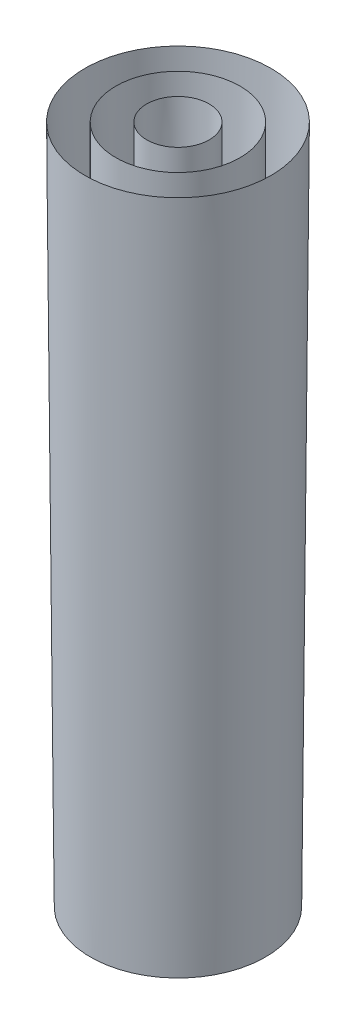
ISO-10303-21;
HEADER;
FILE_DESCRIPTION(('STEP AP214'),'2;1');
FILE_NAME('part.step','',(''),(''),'','','');
FILE_SCHEMA(('AUTOMOTIVE_DESIGN { 1 0 10303 214 1 1 1 1 }'));
ENDSEC;
DATA;
#1=APPLICATION_CONTEXT('core data for automotive mechanical design processes');
#2=APPLICATION_PROTOCOL_DEFINITION('international standard','automotive_design',2000,#1);
#3=PRODUCT_CONTEXT('',#1,'mechanical');
#4=PRODUCT('Part','Part','',(#3));
#5=PRODUCT_RELATED_PRODUCT_CATEGORY('part','',(#4));
#6=PRODUCT_DEFINITION_FORMATION('','',#4);
#7=PRODUCT_DEFINITION_CONTEXT('part definition',#1,'design');
#8=PRODUCT_DEFINITION('design','',#6,#7);
#9=PRODUCT_DEFINITION_SHAPE('','',#8);
#10=(LENGTH_UNIT() NAMED_UNIT(*) SI_UNIT(.MILLI.,.METRE.));
#11=(NAMED_UNIT(*) PLANE_ANGLE_UNIT() SI_UNIT($,.RADIAN.));
#12=(NAMED_UNIT(*) SI_UNIT($,.STERADIAN.) SOLID_ANGLE_UNIT());
#13=UNCERTAINTY_MEASURE_WITH_UNIT(LENGTH_MEASURE(1.E-05),#10,'distance_accuracy_value','');
#14=(GEOMETRIC_REPRESENTATION_CONTEXT(3) GLOBAL_UNCERTAINTY_ASSIGNED_CONTEXT((#13)) GLOBAL_UNIT_ASSIGNED_CONTEXT((#10,
#11,#12)) REPRESENTATION_CONTEXT('',''));
#15=CARTESIAN_POINT('',(0.,0.,0.));
#16=DIRECTION('',(0.,0.,1.));
#17=DIRECTION('',(1.,0.,0.));
#18=AXIS2_PLACEMENT_3D('',#15,#16,#17);
#19=CARTESIAN_POINT('',(-2.68774089119618,-0.113977440196589,0.));
#20=DIRECTION('',(0.,-1.,0.));
#21=DIRECTION('',(0.,0.,-1.));
#22=AXIS2_PLACEMENT_3D('',#19,#20,#21);
#23=CYLINDRICAL_SURFACE('',#22,13.2432946864507);
#24=CARTESIAN_POINT('',(-2.68774089119618,145.,0.));
#25=DIRECTION('',(0.,-1.,0.));
#26=DIRECTION('',(0.,0.,-1.));
#27=AXIS2_PLACEMENT_3D('',#24,#25,#26);
#28=CIRCLE('',#27,13.2432946864507);
#29=CARTESIAN_POINT('',(-2.68774089119618,145.,-13.2432946864507));
#30=VERTEX_POINT('',#29);
#31=EDGE_CURVE('E10',#30,#30,#28,.T.);
#32=ORIENTED_EDGE('',*,*,#31,.T.);
#33=EDGE_LOOP('',(#32));
#34=FACE_BOUND('',#33,.T.);
#35=CARTESIAN_POINT('',(-2.68774089119618,0.,0.));
#36=DIRECTION('',(0.,-1.,0.));
#37=DIRECTION('',(0.,0.,-1.));
#38=AXIS2_PLACEMENT_3D('',#35,#36,#37);
#39=CIRCLE('',#38,13.2432946864507);
#40=CARTESIAN_POINT('',(-2.68774089119618,0.,-13.2432946864507));
#41=VERTEX_POINT('',#40);
#42=EDGE_CURVE('E90',#41,#41,#39,.T.);
#43=ORIENTED_EDGE('',*,*,#42,.F.);
#44=EDGE_LOOP('',(#43));
#45=FACE_BOUND('',#44,.T.);
#46=ADVANCED_FACE('F35',(#34,#45),#23,.T.);
#47=CARTESIAN_POINT('',(-2.68774089119618,145.,0.));
#48=DIRECTION('',(0.,1.,0.));
#49=DIRECTION('',(0.,0.,1.));
#50=AXIS2_PLACEMENT_3D('',#47,#48,#49);
#51=CONICAL_SURFACE('',#50,13.2432946864507,0.0454158552823225);
#52=CARTESIAN_POINT('',(-2.68774089119618,0.,0.));
#53=DIRECTION('',(0.,-1.,0.));
#54=DIRECTION('',(0.,0.,-1.));
#55=AXIS2_PLACEMENT_3D('',#52,#53,#54);
#56=CIRCLE('',#55,6.65346431954343);
#57=CARTESIAN_POINT('',(-2.68774089119618,0.,-6.65346431954343));
#58=VERTEX_POINT('',#57);
#59=EDGE_CURVE('E41',#58,#58,#56,.T.);
#60=ORIENTED_EDGE('',*,*,#59,.T.);
#61=EDGE_LOOP('',(#60));
#62=FACE_BOUND('',#61,.T.);
#63=ORIENTED_EDGE('',*,*,#31,.F.);
#64=EDGE_LOOP('',(#63));
#65=FACE_BOUND('',#64,.T.);
#66=ADVANCED_FACE('F98',(#62,#65),#51,.F.);
#67=CARTESIAN_POINT('',(-2.68774089119618,-0.113977440196589,0.));
#68=DIRECTION('',(0.,-1.,0.));
#69=DIRECTION('',(0.,0.,-1.));
#70=AXIS2_PLACEMENT_3D('',#67,#68,#69);
#71=CYLINDRICAL_SURFACE('',#70,6.65346431954342);
#72=CARTESIAN_POINT('',(-2.68774089119618,145.,0.));
#73=DIRECTION('',(0.,-1.,0.));
#74=DIRECTION('',(0.,0.,-1.));
#75=AXIS2_PLACEMENT_3D('',#72,#73,#74);
#76=CIRCLE('',#75,6.65346431954341);
#77=CARTESIAN_POINT('',(-2.68774089119618,145.,6.65346431954341));
#78=VERTEX_POINT('',#77);
#79=EDGE_CURVE('E45',#78,#78,#76,.T.);
#80=ORIENTED_EDGE('',*,*,#79,.T.);
#81=EDGE_LOOP('',(#80));
#82=FACE_BOUND('',#81,.T.);
#83=ORIENTED_EDGE('',*,*,#59,.F.);
#84=EDGE_LOOP('',(#83));
#85=FACE_BOUND('',#84,.T.);
#86=ADVANCED_FACE('F102',(#82,#85),#71,.T.);
#87=CARTESIAN_POINT('',(-2.68774089119618,145.,0.));
#88=DIRECTION('',(0.,1.,0.));
#89=DIRECTION('',(0.,0.,1.));
#90=AXIS2_PLACEMENT_3D('',#87,#88,#89);
#91=CONICAL_SURFACE('',#90,6.65346431954341,0.0454158552823225);
#92=CARTESIAN_POINT('',(-2.68774089119618,0.,0.));
#93=DIRECTION('',(0.,-1.,0.));
#94=DIRECTION('',(0.,0.,-1.));
#95=AXIS2_PLACEMENT_3D('',#92,#93,#94);
#96=CIRCLE('',#95,0.0636339526361657);
#97=CARTESIAN_POINT('',(-2.68774089119618,0.,0.0636339526361674));
#98=VERTEX_POINT('',#97);
#99=EDGE_CURVE('E49',#98,#98,#96,.T.);
#100=CARTESIAN_POINT('',(-2.68774089119618,0.,0.0636339526361674));
#101=CARTESIAN_POINT('',(-2.68774089119618,1.51041666666669,0.132278018958117));
#102=CARTESIAN_POINT('',(-2.68774089119618,3.02083333333335,0.200922085280068));
#103=CARTESIAN_POINT('',(-2.68774089119618,6.04166666666669,0.338210217923969));
#104=CARTESIAN_POINT('',(-2.68774089119618,7.55208333333336,0.40685428424592));
#105=CARTESIAN_POINT('',(-2.68774089119618,10.5729166666667,0.54414241688982));
#106=CARTESIAN_POINT('',(-2.68774089119618,12.0833333333334,0.612786483211771));
#107=CARTESIAN_POINT('',(-2.68774089119618,15.1041666666667,0.750074615855671));
#108=CARTESIAN_POINT('',(-2.68774089119618,16.6145833333334,0.818718682177622));
#109=CARTESIAN_POINT('',(-2.68774089119618,19.6354166666667,0.956006814821524));
#110=CARTESIAN_POINT('',(-2.68774089119618,21.1458333333334,1.02465088114347));
#111=CARTESIAN_POINT('',(-2.68774089119618,24.1666666666667,1.16193901378737));
#112=CARTESIAN_POINT('',(-2.68774089119618,25.6770833333334,1.23058308010933));
#113=CARTESIAN_POINT('',(-2.68774089119618,28.6979166666667,1.36787121275323));
#114=CARTESIAN_POINT('',(-2.68774089119618,30.2083333333334,1.43651527907518));
#115=CARTESIAN_POINT('',(-2.68774089119618,33.2291666666667,1.57380341171908));
#116=CARTESIAN_POINT('',(-2.68774089119618,34.7395833333334,1.64244747804103));
#117=CARTESIAN_POINT('',(-2.68774089119618,37.7604166666667,1.77973561068493));
#118=CARTESIAN_POINT('',(-2.68774089119618,39.2708333333334,1.84837967700688));
#119=CARTESIAN_POINT('',(-2.68774089119618,42.2916666666667,1.98566780965078));
#120=CARTESIAN_POINT('',(-2.68774089119618,43.8020833333334,2.05431187597273));
#121=CARTESIAN_POINT('',(-2.68774089119618,46.8229166666667,2.19160000861663));
#122=CARTESIAN_POINT('',(-2.68774089119618,48.3333333333334,2.26024407493858));
#123=CARTESIAN_POINT('',(-2.68774089119618,51.3541666666667,2.39753220758248));
#124=CARTESIAN_POINT('',(-2.68774089119618,52.8645833333334,2.46617627390443));
#125=CARTESIAN_POINT('',(-2.68774089119618,55.8854166666667,2.60346440654833));
#126=CARTESIAN_POINT('',(-2.68774089119618,57.3958333333334,2.67210847287028));
#127=CARTESIAN_POINT('',(-2.68774089119618,60.4166666666667,2.80939660551419));
#128=CARTESIAN_POINT('',(-2.68774089119618,61.9270833333334,2.87804067183614));
#129=CARTESIAN_POINT('',(-2.68774089119618,64.9479166666667,3.01532880448004));
#130=CARTESIAN_POINT('',(-2.68774089119618,66.4583333333334,3.08397287080199));
#131=CARTESIAN_POINT('',(-2.68774089119618,69.4791666666667,3.22126100344589));
#132=CARTESIAN_POINT('',(-2.68774089119618,70.9895833333334,3.28990506976784));
#133=CARTESIAN_POINT('',(-2.68774089119618,74.0104166666667,3.42719320241174));
#134=CARTESIAN_POINT('',(-2.68774089119618,75.5208333333334,3.49583726873369));
#135=CARTESIAN_POINT('',(-2.68774089119618,78.5416666666667,3.63312540137759));
#136=CARTESIAN_POINT('',(-2.68774089119618,80.0520833333334,3.70176946769954));
#137=CARTESIAN_POINT('',(-2.68774089119618,83.0729166666667,3.83905760034344));
#138=CARTESIAN_POINT('',(-2.68774089119618,84.5833333333334,3.90770166666539));
#139=CARTESIAN_POINT('',(-2.68774089119618,87.6041666666667,4.04498979930929));
#140=CARTESIAN_POINT('',(-2.68774089119618,89.1145833333334,4.11363386563125));
#141=CARTESIAN_POINT('',(-2.68774089119618,92.1354166666667,4.25092199827515));
#142=CARTESIAN_POINT('',(-2.68774089119618,93.6458333333334,4.3195660645971));
#143=CARTESIAN_POINT('',(-2.68774089119618,96.6666666666667,4.456854197241));
#144=CARTESIAN_POINT('',(-2.68774089119618,98.1770833333334,4.52549826356295));
#145=CARTESIAN_POINT('',(-2.68774089119618,101.197916666667,4.66278639620685));
#146=CARTESIAN_POINT('',(-2.68774089119618,102.708333333333,4.7314304625288));
#147=CARTESIAN_POINT('',(-2.68774089119618,105.729166666667,4.8687185951727));
#148=CARTESIAN_POINT('',(-2.68774089119618,107.239583333333,4.93736266149465));
#149=CARTESIAN_POINT('',(-2.68774089119618,110.260416666667,5.07465079413855));
#150=CARTESIAN_POINT('',(-2.68774089119618,111.770833333333,5.1432948604605));
#151=CARTESIAN_POINT('',(-2.68774089119618,114.791666666667,5.2805829931044));
#152=CARTESIAN_POINT('',(-2.68774089119618,116.302083333333,5.34922705942635));
#153=CARTESIAN_POINT('',(-2.68774089119618,119.322916666667,5.48651519207025));
#154=CARTESIAN_POINT('',(-2.68774089119618,120.833333333333,5.5551592583922));
#155=CARTESIAN_POINT('',(-2.68774089119618,123.854166666667,5.6924473910361));
#156=CARTESIAN_POINT('',(-2.68774089119618,125.364583333333,5.76109145735805));
#157=CARTESIAN_POINT('',(-2.68774089119618,128.385416666667,5.89837959000196));
#158=CARTESIAN_POINT('',(-2.68774089119618,129.895833333333,5.96702365632391));
#159=CARTESIAN_POINT('',(-2.68774089119618,132.916666666667,6.10431178896781));
#160=CARTESIAN_POINT('',(-2.68774089119618,134.427083333333,6.17295585528976));
#161=CARTESIAN_POINT('',(-2.68774089119618,137.447916666667,6.31024398793366));
#162=CARTESIAN_POINT('',(-2.68774089119618,138.958333333333,6.37888805425561));
#163=CARTESIAN_POINT('',(-2.68774089119618,141.979166666667,6.51617618689951));
#164=CARTESIAN_POINT('',(-2.68774089119618,143.489583333333,6.58482025322146));
#165=CARTESIAN_POINT('',(-2.68774089119618,145.,6.65346431954341));
#166=B_SPLINE_CURVE_WITH_KNOTS('',3,(#100,#101,#102,#103,#104,#105,#106,#107,#108,#109,#110,
#111,#112,#113,#114,#115,#116,#117,#118,#119,#120,#121,#122,#123,#124,#125,#126,#127,#128,#129,
#130,#131,#132,#133,#134,#135,#136,#137,#138,#139,#140,#141,#142,#143,#144,#145,#146,#147,#148,
#149,#150,#151,#152,#153,#154,#155,#156,#157,#158,#159,#160,#161,#162,#163,#164,#165),
.UNSPECIFIED.,.F.,.F.,(4,2,2,2,2,2,2,2,2,2,2,2,2,2,2,2,2,2,2,2,2,2,2,2,2,2,2,2,2,2,2,2,4),(0.,
4.53592709741578,9.0718541948316,13.6077812922474,18.1437083896632,22.679635487079,
27.2155625844948,31.7514896819106,36.2874167793264,40.8233438767422,45.359270974158,
49.8951980715738,54.4311251689896,58.9670522664054,63.5029793638212,68.038906461237,
72.5748335586528,77.1107606560685,81.6466877534843,86.1826148509001,90.7185419483159,
95.2544690457317,99.7903961431475,104.326323240563,108.862250337979,113.398177435395,
117.934104532811,122.470031630226,127.005958727642,131.541885825058,136.077812922474,
140.61374001989,145.149667117305),.UNSPECIFIED.);
#167=EDGE_CURVE('BSEAM106',#98,#78,#166,.T.);
#168=ORIENTED_EDGE('',*,*,#99,.T.);
#169=ORIENTED_EDGE('',*,*,#79,.F.);
#170=ORIENTED_EDGE('',*,*,#167,.T.);
#171=ORIENTED_EDGE('',*,*,#167,.F.);
#172=EDGE_LOOP('',(#168,#170,#169,#171));
#173=FACE_BOUND('',#172,.T.);
#174=ADVANCED_FACE('F106',(#173),#91,.F.);
#175=CARTESIAN_POINT('',(-2.62410693856001,0.,0.));
#176=DIRECTION('',(0.,-1.,0.));
#177=DIRECTION('',(0.,0.,-1.));
#178=AXIS2_PLACEMENT_3D('',#175,#176,#177);
#179=PLANE('',#178);
#180=CARTESIAN_POINT('',(-2.68774089119618,0.,0.));
#181=DIRECTION('',(0.,-1.,0.));
#182=DIRECTION('',(0.,0.,-1.));
#183=AXIS2_PLACEMENT_3D('',#180,#181,#182);
#184=CIRCLE('',#183,0.752054863031253);
#185=CARTESIAN_POINT('',(-2.68774089119618,0.,0.752054863031253));
#186=VERTEX_POINT('',#185);
#187=EDGE_CURVE('E54',#186,#186,#184,.T.);
#188=ORIENTED_EDGE('',*,*,#187,.T.);
#189=EDGE_LOOP('',(#188));
#190=FACE_BOUND('',#189,.T.);
#191=ORIENTED_EDGE('',*,*,#99,.F.);
#192=EDGE_LOOP('',(#191));
#193=FACE_BOUND('',#192,.T.);
#194=ADVANCED_FACE('F113',(#190,#193),#179,.T.);
#195=CARTESIAN_POINT('',(-2.68774089119618,0.,0.));
#196=DIRECTION('',(0.,1.,0.));
#197=DIRECTION('',(0.,0.,1.));
#198=AXIS2_PLACEMENT_3D('',#195,#196,#197);
#199=CONICAL_SURFACE('',#198,0.752054863031253,0.0468597845553266);
#200=CARTESIAN_POINT('',(-2.68774089119618,109.948786309102,0.));
#201=DIRECTION('',(0.,-1.,0.));
#202=DIRECTION('',(0.,0.,-1.));
#203=AXIS2_PLACEMENT_3D('',#200,#201,#202);
#204=CIRCLE('',#203,5.9080057342038);
#205=CARTESIAN_POINT('',(-2.68774089119618,109.948786309102,5.9080057342038));
#206=VERTEX_POINT('',#205);
#207=EDGE_CURVE('E57',#206,#206,#204,.T.);
#208=CARTESIAN_POINT('',(-2.68774089119618,109.948786309102,5.9080057342038));
#209=CARTESIAN_POINT('',(-2.68774089119618,108.803486451716,5.85429791262909));
#210=CARTESIAN_POINT('',(-2.68774089119618,107.658186594329,5.80059009105437));
#211=CARTESIAN_POINT('',(-2.68774089119618,105.367586879556,5.69317444790494));
#212=CARTESIAN_POINT('',(-2.68774089119618,104.22228702217,5.63946662633023));
#213=CARTESIAN_POINT('',(-2.68774089119618,101.931687307397,5.5320509831808));
#214=CARTESIAN_POINT('',(-2.68774089119618,100.78638745001,5.47834316160609));
#215=CARTESIAN_POINT('',(-2.68774089119618,98.4957877352372,5.37092751845666));
#216=CARTESIAN_POINT('',(-2.68774089119618,97.3504878778508,5.31721969688194));
#217=CARTESIAN_POINT('',(-2.68774089119618,95.0598881630778,5.20980405373252));
#218=CARTESIAN_POINT('',(-2.68774089119618,93.9145883056913,5.1560962321578));
#219=CARTESIAN_POINT('',(-2.68774089119618,91.6239885909184,5.04868058900838));
#220=CARTESIAN_POINT('',(-2.68774089119618,90.4786887335319,4.99497276743366));
#221=CARTESIAN_POINT('',(-2.68774089119618,88.1880890187589,4.88755712428423));
#222=CARTESIAN_POINT('',(-2.68774089119618,87.0427891613725,4.83384930270952));
#223=CARTESIAN_POINT('',(-2.68774089119618,84.7521894465995,4.72643365956009));
#224=CARTESIAN_POINT('',(-2.68774089119618,83.606889589213,4.67272583798538));
#225=CARTESIAN_POINT('',(-2.68774089119618,81.31628987444,4.56531019483595));
#226=CARTESIAN_POINT('',(-2.68774089119618,80.1709900170536,4.51160237326124));
#227=CARTESIAN_POINT('',(-2.68774089119618,77.8803903022806,4.40418673011181));
#228=CARTESIAN_POINT('',(-2.68774089119618,76.7350904448941,4.35047890853709));
#229=CARTESIAN_POINT('',(-2.68774089119618,74.4444907301212,4.24306326538767));
#230=CARTESIAN_POINT('',(-2.68774089119618,73.2991908727347,4.18935544381295));
#231=CARTESIAN_POINT('',(-2.68774089119618,71.0085911579617,4.08193980066352));
#232=CARTESIAN_POINT('',(-2.68774089119618,69.8632913005753,4.02823197908881));
#233=CARTESIAN_POINT('',(-2.68774089119618,67.5726915858023,3.92081633593938));
#234=CARTESIAN_POINT('',(-2.68774089119618,66.4273917284158,3.86710851436467));
#235=CARTESIAN_POINT('',(-2.68774089119618,64.1367920136429,3.75969287121524));
#236=CARTESIAN_POINT('',(-2.68774089119618,62.9914921562564,3.70598504964052));
#237=CARTESIAN_POINT('',(-2.68774089119618,60.7008924414834,3.5985694064911));
#238=CARTESIAN_POINT('',(-2.68774089119618,59.5555925840969,3.54486158491638));
#239=CARTESIAN_POINT('',(-2.68774089119618,57.264992869324,3.43744594176695));
#240=CARTESIAN_POINT('',(-2.68774089119618,56.1196930119375,3.38373812019224));
#241=CARTESIAN_POINT('',(-2.68774089119618,53.8290932971645,3.27632247704281));
#242=CARTESIAN_POINT('',(-2.68774089119618,52.6837934397781,3.2226146554681));
#243=CARTESIAN_POINT('',(-2.68774089119618,50.3931937250051,3.11519901231867));
#244=CARTESIAN_POINT('',(-2.68774089119618,49.2478938676186,3.06149119074396));
#245=CARTESIAN_POINT('',(-2.68774089119618,46.9572941528457,2.95407554759453));
#246=CARTESIAN_POINT('',(-2.68774089119618,45.8119942954592,2.90036772601981));
#247=CARTESIAN_POINT('',(-2.68774089119618,43.5213945806862,2.79295208287039));
#248=CARTESIAN_POINT('',(-2.68774089119618,42.3760947232998,2.73924426129567));
#249=CARTESIAN_POINT('',(-2.68774089119618,40.0854950085268,2.63182861814624));
#250=CARTESIAN_POINT('',(-2.68774089119618,38.9401951511403,2.57812079657153));
#251=CARTESIAN_POINT('',(-2.68774089119618,36.6495954363673,2.4707051534221));
#252=CARTESIAN_POINT('',(-2.68774089119618,35.5042955789809,2.41699733184739));
#253=CARTESIAN_POINT('',(-2.68774089119618,33.2136958642079,2.30958168869796));
#254=CARTESIAN_POINT('',(-2.68774089119618,32.0683960068214,2.25587386712325));
#255=CARTESIAN_POINT('',(-2.68774089119618,29.7777962920485,2.14845822397382));
#256=CARTESIAN_POINT('',(-2.68774089119618,28.632496434662,2.0947504023991));
#257=CARTESIAN_POINT('',(-2.68774089119618,26.341896719889,1.98733475924968));
#258=CARTESIAN_POINT('',(-2.68774089119618,25.1965968625026,1.93362693767496));
#259=CARTESIAN_POINT('',(-2.68774089119618,22.9059971477296,1.82621129452553));
#260=CARTESIAN_POINT('',(-2.68774089119618,21.7606972903431,1.77250347295082));
#261=CARTESIAN_POINT('',(-2.68774089119618,19.4700975755702,1.66508782980139));
#262=CARTESIAN_POINT('',(-2.68774089119618,18.3247977181837,1.61138000822668));
#263=CARTESIAN_POINT('',(-2.68774089119618,16.0341980034107,1.50396436507725));
#264=CARTESIAN_POINT('',(-2.68774089119618,14.8888981460242,1.45025654350253));
#265=CARTESIAN_POINT('',(-2.68774089119618,12.5982984312513,1.34284090035311));
#266=CARTESIAN_POINT('',(-2.68774089119618,11.4529985738648,1.28913307877839));
#267=CARTESIAN_POINT('',(-2.68774089119618,9.16239885909183,1.18171743562896));
#268=CARTESIAN_POINT('',(-2.68774089119618,8.01709900170535,1.12800961405425));
#269=CARTESIAN_POINT('',(-2.68774089119618,5.72649928693239,1.02059397090482));
#270=CARTESIAN_POINT('',(-2.68774089119618,4.58119942954592,0.966886149330109));
#271=CARTESIAN_POINT('',(-2.68774089119618,2.29059971477296,0.859470506180681));
#272=CARTESIAN_POINT('',(-2.68774089119618,1.14529985738648,0.805762684605967));
#273=CARTESIAN_POINT('',(-2.68774089119618,0.,0.752054863031253));
#274=B_SPLINE_CURVE_WITH_KNOTS('',3,(#208,#209,#210,#211,#212,#213,#214,#215,#216,#217,#218,
#219,#220,#221,#222,#223,#224,#225,#226,#227,#228,#229,#230,#231,#232,#233,#234,#235,#236,#237,
#238,#239,#240,#241,#242,#243,#244,#245,#246,#247,#248,#249,#250,#251,#252,#253,#254,#255,#256,
#257,#258,#259,#260,#261,#262,#263,#264,#265,#266,#267,#268,#269,#270,#271,#272,#273),
.UNSPECIFIED.,.F.,.F.,(4,2,2,2,2,2,2,2,2,2,2,2,2,2,2,2,2,2,2,2,2,2,2,2,2,2,2,2,2,2,2,2,4),(0.,
3.43967536852682,6.87935073705364,10.3190261055805,13.7587014741073,17.1983768426341,
20.6380522111609,24.0777275796878,27.5174029482146,30.9570783167414,34.3967536852682,
37.836429053795,41.2761044223219,44.7157797908487,48.1554551593755,51.5951305279023,
55.0348058964292,58.474481264956,61.9141566334828,65.3538320020096,68.7935073705364,
72.2331827390633,75.6728581075901,79.1125334761169,82.5522088446438,85.9918842131706,
89.4315595816974,92.8712349502242,96.3109103187511,99.7505856872779,103.190261055805,
106.629936424332,110.069611792858),.UNSPECIFIED.);
#275=EDGE_CURVE('BSEAM117',#206,#186,#274,.T.);
#276=ORIENTED_EDGE('',*,*,#207,.T.);
#277=ORIENTED_EDGE('',*,*,#187,.F.);
#278=ORIENTED_EDGE('',*,*,#275,.T.);
#279=ORIENTED_EDGE('',*,*,#275,.F.);
#280=EDGE_LOOP('',(#276,#278,#277,#279));
#281=FACE_BOUND('',#280,.T.);
#282=ADVANCED_FACE('F117',(#281),#199,.T.);
#283=CARTESIAN_POINT('',(-2.68774089119618,109.948786309102,0.));
#284=DIRECTION('',(0.,-1.,0.));
#285=DIRECTION('',(0.,0.,-1.));
#286=AXIS2_PLACEMENT_3D('',#283,#284,#285);
#287=CONICAL_SURFACE('',#286,5.9080057342038,0.00276014159136249);
#288=CARTESIAN_POINT('',(-2.68774089119618,-0.379076084828081,0.));
#289=DIRECTION('',(0.,-1.,0.));
#290=DIRECTION('',(0.,0.,-1.));
#291=AXIS2_PLACEMENT_3D('',#288,#289,#290);
#292=CIRCLE('',#291,6.21252702920361);
#293=CARTESIAN_POINT('',(-2.68774089119618,-0.379076084828081,-6.21252702920361));
#294=VERTEX_POINT('',#293);
#295=EDGE_CURVE('E60',#294,#294,#292,.T.);
#296=ORIENTED_EDGE('',*,*,#295,.T.);
#297=EDGE_LOOP('',(#296));
#298=FACE_BOUND('',#297,.T.);
#299=ORIENTED_EDGE('',*,*,#207,.F.);
#300=EDGE_LOOP('',(#299));
#301=FACE_BOUND('',#300,.T.);
#302=ADVANCED_FACE('F121',(#298,#301),#287,.F.);
#303=CARTESIAN_POINT('',(3.52478613800743,-0.379076084828079,0.));
#304=DIRECTION('',(0.,-1.,0.));
#305=DIRECTION('',(0.,0.,-1.));
#306=AXIS2_PLACEMENT_3D('',#303,#304,#305);
#307=PLANE('',#306);
#308=CARTESIAN_POINT('',(-2.68774089119618,-0.379076084828076,0.));
#309=DIRECTION('',(0.,-1.,0.));
#310=DIRECTION('',(0.,0.,-1.));
#311=AXIS2_PLACEMENT_3D('',#308,#309,#310);
#312=CIRCLE('',#311,6.98180335414102);
#313=CARTESIAN_POINT('',(-2.68774089119618,-0.379076084828076,-6.98180335414102));
#314=VERTEX_POINT('',#313);
#315=EDGE_CURVE('E63',#314,#314,#312,.T.);
#316=ORIENTED_EDGE('',*,*,#315,.T.);
#317=EDGE_LOOP('',(#316));
#318=FACE_BOUND('',#317,.T.);
#319=ORIENTED_EDGE('',*,*,#295,.F.);
#320=EDGE_LOOP('',(#319));
#321=FACE_BOUND('',#320,.T.);
#322=ADVANCED_FACE('F125',(#318,#321),#307,.T.);
#323=CARTESIAN_POINT('',(-2.68774089119618,6.14796577547872,0.));
#324=DIRECTION('',(0.,1.,0.));
#325=DIRECTION('',(0.,0.,1.));
#326=AXIS2_PLACEMENT_3D('',#323,#324,#325);
#327=CONICAL_SURFACE('',#326,7.28788319636154,0.0468597845553265);
#328=CARTESIAN_POINT('',(-2.68774089119618,109.948786309102,0.));
#329=DIRECTION('',(0.,-1.,0.));
#330=DIRECTION('',(0.,0.,-1.));
#331=AXIS2_PLACEMENT_3D('',#328,#329,#330);
#332=CIRCLE('',#331,12.1555306622841);
#333=CARTESIAN_POINT('',(-2.68774089119618,109.948786309102,-12.1555306622841));
#334=VERTEX_POINT('',#333);
#335=EDGE_CURVE('E66',#334,#334,#332,.T.);
#336=ORIENTED_EDGE('',*,*,#335,.T.);
#337=EDGE_LOOP('',(#336));
#338=FACE_BOUND('',#337,.T.);
#339=ORIENTED_EDGE('',*,*,#315,.F.);
#340=EDGE_LOOP('',(#339));
#341=FACE_BOUND('',#340,.T.);
#342=ADVANCED_FACE('F129',(#338,#341),#327,.T.);
#343=CARTESIAN_POINT('',(-2.68774089119618,109.948786309102,0.));
#344=DIRECTION('',(0.,-1.,0.));
#345=DIRECTION('',(0.,0.,-1.));
#346=AXIS2_PLACEMENT_3D('',#343,#344,#345);
#347=CONICAL_SURFACE('',#346,12.1555306622841,0.00651541421237793);
#348=CARTESIAN_POINT('',(-2.68774089119618,-0.425210075833002,0.));
#349=DIRECTION('',(0.,-1.,0.));
#350=DIRECTION('',(0.,0.,-1.));
#351=AXIS2_PLACEMENT_3D('',#348,#349,#350);
#352=CIRCLE('',#351,12.8746731430515);
#353=CARTESIAN_POINT('',(-2.68774089119618,-0.425210075833002,-12.8746731430515));
#354=VERTEX_POINT('',#353);
#355=EDGE_CURVE('E69',#354,#354,#352,.T.);
#356=ORIENTED_EDGE('',*,*,#355,.T.);
#357=EDGE_LOOP('',(#356));
#358=FACE_BOUND('',#357,.T.);
#359=ORIENTED_EDGE('',*,*,#335,.F.);
#360=EDGE_LOOP('',(#359));
#361=FACE_BOUND('',#360,.T.);
#362=ADVANCED_FACE('F133',(#358,#361),#347,.F.);
#363=CARTESIAN_POINT('',(10.1869322518554,-0.425210075833005,0.));
#364=DIRECTION('',(0.,-1.,0.));
#365=DIRECTION('',(0.,0.,-1.));
#366=AXIS2_PLACEMENT_3D('',#363,#364,#365);
#367=PLANE('',#366);
#368=CARTESIAN_POINT('',(-2.68774089119618,-0.425210075833009,0.));
#369=DIRECTION('',(0.,-1.,0.));
#370=DIRECTION('',(0.,0.,-1.));
#371=AXIS2_PLACEMENT_3D('',#368,#369,#370);
#372=CIRCLE('',#371,13.6972878359906);
#373=CARTESIAN_POINT('',(-2.68774089119618,-0.425210075833009,-13.6972878359906));
#374=VERTEX_POINT('',#373);
#375=EDGE_CURVE('E72',#374,#374,#372,.T.);
#376=ORIENTED_EDGE('',*,*,#375,.T.);
#377=EDGE_LOOP('',(#376));
#378=FACE_BOUND('',#377,.T.);
#379=ORIENTED_EDGE('',*,*,#355,.F.);
#380=EDGE_LOOP('',(#379));
#381=FACE_BOUND('',#380,.T.);
#382=ADVANCED_FACE('F137',(#378,#381),#367,.T.);
#383=CARTESIAN_POINT('',(-2.68774089119618,-0.425210075833009,0.));
#384=DIRECTION('',(0.,1.,0.));
#385=DIRECTION('',(0.,0.,1.));
#386=AXIS2_PLACEMENT_3D('',#383,#384,#385);
#387=CONICAL_SURFACE('',#386,13.6972878359906,0.0468597845553265);
#388=CARTESIAN_POINT('',(-2.68774089119618,13.9633764616789,0.));
#389=DIRECTION('',(0.,-1.,0.));
#390=DIRECTION('',(0.,0.,-1.));
#391=AXIS2_PLACEMENT_3D('',#388,#389,#390);
#392=CIRCLE('',#391,14.372027847076);
#393=CARTESIAN_POINT('',(-2.68774089119618,13.9633764616789,-14.372027847076));
#394=VERTEX_POINT('',#393);
#395=EDGE_CURVE('E75',#394,#394,#392,.T.);
#396=ORIENTED_EDGE('',*,*,#395,.T.);
#397=EDGE_LOOP('',(#396));
#398=FACE_BOUND('',#397,.T.);
#399=ORIENTED_EDGE('',*,*,#375,.F.);
#400=EDGE_LOOP('',(#399));
#401=FACE_BOUND('',#400,.T.);
#402=ADVANCED_FACE('F141',(#398,#401),#387,.T.);
#403=CARTESIAN_POINT('',(-2.68774089119618,13.9633764616789,0.));
#404=DIRECTION('',(0.,1.,0.));
#405=DIRECTION('',(0.,0.,1.));
#406=AXIS2_PLACEMENT_3D('',#403,#404,#405);
#407=CONICAL_SURFACE('',#406,14.372027847076,0.0431613688581194);
#408=CARTESIAN_POINT('',(-2.68774089119618,110.472540020142,0.));
#409=DIRECTION('',(0.,-1.,0.));
#410=DIRECTION('',(0.,0.,-1.));
#411=AXIS2_PLACEMENT_3D('',#408,#409,#410);
#412=CIRCLE('',#411,18.5400840042746);
#413=CARTESIAN_POINT('',(-2.68774089119618,110.472540020142,-18.5400840042746));
#414=VERTEX_POINT('',#413);
#415=EDGE_CURVE('E78',#414,#414,#412,.T.);
#416=ORIENTED_EDGE('',*,*,#415,.T.);
#417=EDGE_LOOP('',(#416));
#418=FACE_BOUND('',#417,.T.);
#419=ORIENTED_EDGE('',*,*,#395,.F.);
#420=EDGE_LOOP('',(#419));
#421=FACE_BOUND('',#420,.T.);
#422=ADVANCED_FACE('F145',(#418,#421),#407,.T.);
#423=CARTESIAN_POINT('',(-2.68774089119618,110.472540020142,0.));
#424=DIRECTION('',(0.,1.,0.));
#425=DIRECTION('',(0.,0.,1.));
#426=AXIS2_PLACEMENT_3D('',#423,#424,#425);
#427=CONICAL_SURFACE('',#426,18.5400840042746,0.00489262385595541);
#428=CARTESIAN_POINT('',(-2.68774089119618,0.,0.));
#429=DIRECTION('',(0.,-1.,0.));
#430=DIRECTION('',(0.,0.,-1.));
#431=AXIS2_PLACEMENT_3D('',#428,#429,#430);
#432=CIRCLE('',#431,17.9995791067102);
#433=CARTESIAN_POINT('',(-2.68774089119618,0.,-17.9995791067102));
#434=VERTEX_POINT('',#433);
#435=EDGE_CURVE('E81',#434,#434,#432,.T.);
#436=ORIENTED_EDGE('',*,*,#435,.T.);
#437=EDGE_LOOP('',(#436));
#438=FACE_BOUND('',#437,.T.);
#439=ORIENTED_EDGE('',*,*,#415,.F.);
#440=EDGE_LOOP('',(#439));
#441=FACE_BOUND('',#440,.T.);
#442=ADVANCED_FACE('F149',(#438,#441),#427,.F.);
#443=CARTESIAN_POINT('',(15.311838215514,0.,0.));
#444=DIRECTION('',(0.,-1.,0.));
#445=DIRECTION('',(0.,0.,-1.));
#446=AXIS2_PLACEMENT_3D('',#443,#444,#445);
#447=PLANE('',#446);
#448=CARTESIAN_POINT('',(-2.68774089119618,0.,0.));
#449=DIRECTION('',(0.,-1.,0.));
#450=DIRECTION('',(0.,0.,-1.));
#451=AXIS2_PLACEMENT_3D('',#448,#449,#450);
#452=CIRCLE('',#451,18.6672079496357);
#453=CARTESIAN_POINT('',(-2.68774089119618,0.,-18.6672079496357));
#454=VERTEX_POINT('',#453);
#455=EDGE_CURVE('E84',#454,#454,#452,.T.);
#456=ORIENTED_EDGE('',*,*,#455,.T.);
#457=EDGE_LOOP('',(#456));
#458=FACE_BOUND('',#457,.T.);
#459=ORIENTED_EDGE('',*,*,#435,.F.);
#460=EDGE_LOOP('',(#459));
#461=FACE_BOUND('',#460,.T.);
#462=ADVANCED_FACE('F153',(#458,#461),#447,.T.);
#463=CARTESIAN_POINT('',(-2.68774089119618,0.,0.));
#464=DIRECTION('',(0.,1.,0.));
#465=DIRECTION('',(0.,0.,1.));
#466=AXIS2_PLACEMENT_3D('',#463,#464,#465);
#467=CONICAL_SURFACE('',#466,18.6672079496357,0.00804063432690071);
#468=CARTESIAN_POINT('',(-2.68774089119618,145.,0.));
#469=DIRECTION('',(0.,-1.,0.));
#470=DIRECTION('',(0.,0.,-1.));
#471=AXIS2_PLACEMENT_3D('',#468,#469,#470);
#472=CIRCLE('',#471,19.8331250533579);
#473=CARTESIAN_POINT('',(-2.68774089119618,145.,-19.8331250533579));
#474=VERTEX_POINT('',#473);
#475=EDGE_CURVE('E87',#474,#474,#472,.T.);
#476=ORIENTED_EDGE('',*,*,#475,.T.);
#477=EDGE_LOOP('',(#476));
#478=FACE_BOUND('',#477,.T.);
#479=ORIENTED_EDGE('',*,*,#455,.F.);
#480=EDGE_LOOP('',(#479));
#481=FACE_BOUND('',#480,.T.);
#482=ADVANCED_FACE('F157',(#478,#481),#467,.T.);
#483=CARTESIAN_POINT('',(-2.68774089119618,145.,0.));
#484=DIRECTION('',(0.,1.,0.));
#485=DIRECTION('',(0.,0.,1.));
#486=AXIS2_PLACEMENT_3D('',#483,#484,#485);
#487=CONICAL_SURFACE('',#486,19.8331250533579,0.0454158552823225);
#488=ORIENTED_EDGE('',*,*,#42,.T.);
#489=EDGE_LOOP('',(#488));
#490=FACE_BOUND('',#489,.T.);
#491=ORIENTED_EDGE('',*,*,#475,.F.);
#492=EDGE_LOOP('',(#491));
#493=FACE_BOUND('',#492,.T.);
#494=ADVANCED_FACE('F94',(#490,#493),#487,.F.);
#495=CLOSED_SHELL('',(#46,#66,#86,#174,#194,#282,#302,#322,#342,#362,#382,#402,#422,#442,#462,
#482,#494));
#496=MANIFOLD_SOLID_BREP('B2',#495);
#497=ADVANCED_BREP_SHAPE_REPRESENTATION('',(#18,#496),#14);
#498=SHAPE_DEFINITION_REPRESENTATION(#9,#497);
ENDSEC;
END-ISO-10303-21;
